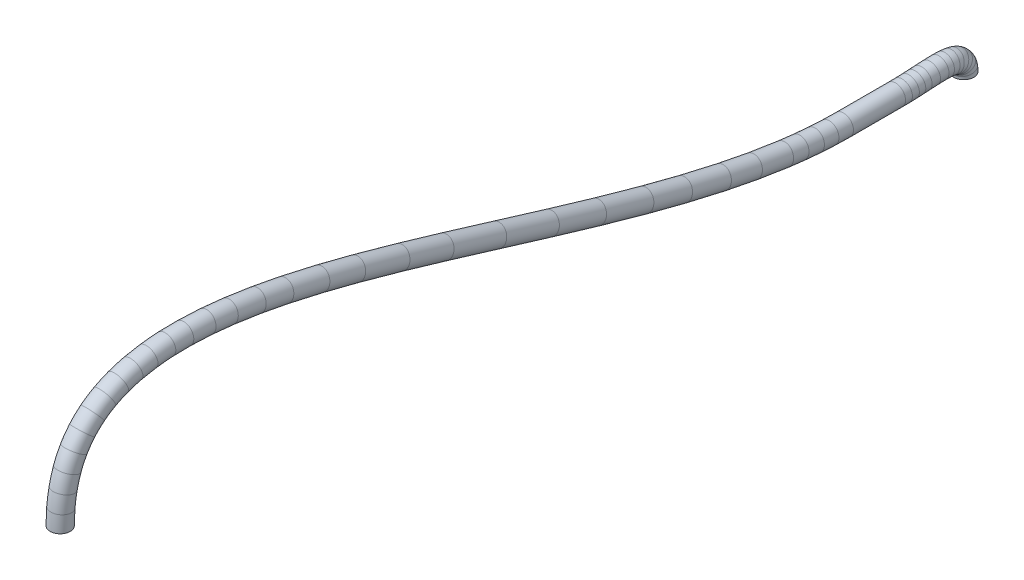
ISO-10303-21;
HEADER;
FILE_DESCRIPTION(('STEP AP214'),'2;1');
FILE_NAME('part.step','',(''),(''),'','','');
FILE_SCHEMA(('AUTOMOTIVE_DESIGN { 1 0 10303 214 1 1 1 1 }'));
ENDSEC;
DATA;
#1=APPLICATION_CONTEXT('core data for automotive mechanical design processes');
#2=APPLICATION_PROTOCOL_DEFINITION('international standard','automotive_design',2000,#1);
#3=PRODUCT_CONTEXT('',#1,'mechanical');
#4=PRODUCT('Part','Part','',(#3));
#5=PRODUCT_RELATED_PRODUCT_CATEGORY('part','',(#4));
#6=PRODUCT_DEFINITION_FORMATION('','',#4);
#7=PRODUCT_DEFINITION_CONTEXT('part definition',#1,'design');
#8=PRODUCT_DEFINITION('design','',#6,#7);
#9=PRODUCT_DEFINITION_SHAPE('','',#8);
#10=(LENGTH_UNIT() NAMED_UNIT(*) SI_UNIT(.MILLI.,.METRE.));
#11=(NAMED_UNIT(*) PLANE_ANGLE_UNIT() SI_UNIT($,.RADIAN.));
#12=(NAMED_UNIT(*) SI_UNIT($,.STERADIAN.) SOLID_ANGLE_UNIT());
#13=UNCERTAINTY_MEASURE_WITH_UNIT(LENGTH_MEASURE(1.E-05),#10,'distance_accuracy_value','');
#14=(GEOMETRIC_REPRESENTATION_CONTEXT(3) GLOBAL_UNCERTAINTY_ASSIGNED_CONTEXT((#13)) GLOBAL_UNIT_ASSIGNED_CONTEXT((#10,
#11,#12)) REPRESENTATION_CONTEXT('',''));
#15=CARTESIAN_POINT('',(0.,0.,0.));
#16=DIRECTION('',(0.,0.,1.));
#17=DIRECTION('',(1.,0.,0.));
#18=AXIS2_PLACEMENT_3D('',#15,#16,#17);
#19=CARTESIAN_POINT('',(-5.24968353162595,128.049999999714,224.960489149716));
#20=DIRECTION('',(0.,1.,0.));
#21=DIRECTION('',(0.,0.,-1.));
#22=AXIS2_PLACEMENT_3D('',#19,#20,#21);
#23=PLANE('',#22);
#24=CARTESIAN_POINT('',(-5.24968353162595,128.049999999714,224.960489149716));
#25=DIRECTION('',(0.,-1.,0.));
#26=DIRECTION('',(0.,0.,-1.));
#27=AXIS2_PLACEMENT_3D('',#24,#25,#26);
#28=CIRCLE('',#27,0.77);
#29=CARTESIAN_POINT('',(-5.24968353162595,128.049999999714,224.190489149716));
#30=VERTEX_POINT('',#29);
#31=EDGE_CURVE('E11',#30,#30,#28,.T.);
#32=ORIENTED_EDGE('',*,*,#31,.T.);
#33=EDGE_LOOP('',(#32));
#34=FACE_BOUND('',#33,.T.);
#35=ADVANCED_FACE('F42',(#34),#23,.F.);
#36=CARTESIAN_POINT('',(-5.07489488065343,128.049999999715,211.014651433645));
#37=DIRECTION('',(-0.999921466294673,0.,-0.012532407714073));
#38=DIRECTION('',(-0.012532407714073,0.,0.999921466294673));
#39=AXIS2_PLACEMENT_3D('',#36,#37,#38);
#40=TOROIDAL_SURFACE('',#39,13.9469330203995,0.77);
#41=ORIENTED_EDGE('',*,*,#31,.F.);
#42=EDGE_LOOP('',(#41));
#43=FACE_BOUND('',#42,.T.);
#44=CARTESIAN_POINT('',(-5.24904137688922,129.244421709112,224.909253639303));
#45=DIRECTION('',(-0.00107328111655938,-0.996326107369345,0.0856337307484272));
#46=DIRECTION('',(-4.60391044394124E-05,-0.0856337307484272,-0.996326684395488));
#47=AXIS2_PLACEMENT_3D('',#44,#45,#46);
#48=CIRCLE('',#47,0.77);
#49=CARTESIAN_POINT('',(-5.24907682699964,129.178483736436,224.142082092318));
#50=VERTEX_POINT('',#49);
#51=EDGE_CURVE('E52',#50,#50,#48,.T.);
#52=ORIENTED_EDGE('',*,*,#51,.T.);
#53=EDGE_LOOP('',(#52));
#54=FACE_BOUND('',#53,.T.);
#55=ADVANCED_FACE('F430',(#43,#54),#40,.T.);
#56=CARTESIAN_POINT('',(-5.12396192345315,128.373826335564,214.781671357992));
#57=DIRECTION('',(0.999923726127993,-1.56135381442176E-05,0.0123507765961815));
#58=DIRECTION('',(0.0123507765976869,0.,-0.999923726249874));
#59=AXIS2_PLACEMENT_3D('',#56,#57,#58);
#60=TOROIDAL_SURFACE('',#59,10.1657023386899,0.77);
#61=CARTESIAN_POINT('',(-5.24689794232879,130.426519028251,224.7372147125));
#62=DIRECTION('',(-0.00250920096557245,-0.979401327154709,0.201907761807487));
#63=DIRECTION('',(-0.000256872652281758,-0.201907759491489,-0.979404508195448));
#64=AXIS2_PLACEMENT_3D('',#61,#62,#63);
#65=CIRCLE('',#64,0.77);
#66=CARTESIAN_POINT('',(-5.24709573427105,130.271050053443,223.983073241189));
#67=VERTEX_POINT('',#66);
#68=EDGE_CURVE('E271',#67,#67,#65,.T.);
#69=ORIENTED_EDGE('',*,*,#68,.T.);
#70=EDGE_LOOP('',(#69));
#71=FACE_BOUND('',#70,.T.);
#72=ORIENTED_EDGE('',*,*,#51,.F.);
#73=EDGE_LOOP('',(#72));
#74=FACE_BOUND('',#73,.T.);
#75=ADVANCED_FACE('F435',(#71,#74),#60,.T.);
#76=CARTESIAN_POINT('',(-5.14297806845378,128.677711002938,216.255499449286));
#77=DIRECTION('',(0.999924861807434,-3.46504543539627E-05,0.0122584476476254));
#78=DIRECTION('',(0.0122584476549845,0.,-0.999924862407716));
#79=AXIS2_PLACEMENT_3D('',#76,#77,#78);
#80=TOROIDAL_SURFACE('',#79,8.66075185280264,0.77);
#81=CARTESIAN_POINT('',(-5.24293003548532,131.574581719271,224.416796669273));
#82=DIRECTION('',(-0.0041328895323715,-0.942401928786135,0.334457058296406));
#83=DIRECTION('',(-0.000714986324046932,-0.334457044428597,-0.942410724804553));
#84=AXIS2_PLACEMENT_3D('',#81,#82,#83);
#85=CIRCLE('',#84,0.77);
#86=CARTESIAN_POINT('',(-5.24348057495484,131.317049795061,223.691140411173));
#87=VERTEX_POINT('',#86);
#88=EDGE_CURVE('E267',#87,#87,#85,.T.);
#89=ORIENTED_EDGE('',*,*,#88,.T.);
#90=EDGE_LOOP('',(#89));
#91=FACE_BOUND('',#90,.T.);
#92=ORIENTED_EDGE('',*,*,#68,.F.);
#93=EDGE_LOOP('',(#92));
#94=FACE_BOUND('',#93,.T.);
#95=ADVANCED_FACE('F543',(#91,#94),#80,.T.);
#96=CARTESIAN_POINT('',(-5.16728173386017,129.341525842741,218.125634719291));
#97=DIRECTION('',(0.999927259751701,-0.000104786281682033,0.0120608550811853));
#98=DIRECTION('',(0.0120608551474004,0.,-0.999927265241384));
#99=AXIS2_PLACEMENT_3D('',#96,#97,#98);
#100=TOROIDAL_SURFACE('',#99,6.67615008025853,0.77);
#101=CARTESIAN_POINT('',(-5.23682959366278,132.656122237585,223.920424942294));
#102=DIRECTION('',(-0.00607896479311672,-0.868046320935459,0.496445999981325));
#103=DIRECTION('',(-0.00162868645288771,-0.496445919935974,-0.868066124186034));
#104=AXIS2_PLACEMENT_3D('',#101,#102,#103);
#105=CIRCLE('',#104,0.77);
#106=CARTESIAN_POINT('',(-5.2380836822315,132.273858879235,223.252014026671));
#107=VERTEX_POINT('',#106);
#108=EDGE_CURVE('E264',#107,#107,#105,.T.);
#109=ORIENTED_EDGE('',*,*,#108,.T.);
#110=EDGE_LOOP('',(#109));
#111=FACE_BOUND('',#110,.T.);
#112=ORIENTED_EDGE('',*,*,#88,.F.);
#113=EDGE_LOOP('',(#112));
#114=FACE_BOUND('',#113,.T.);
#115=ADVANCED_FACE('F572',(#111,#114),#100,.T.);
#116=CARTESIAN_POINT('',(-5.17379080379215,129.618432694617,218.609732497533));
#117=DIRECTION('',(0.999928443325836,-0.000161505477794451,0.0119616948611252));
#118=DIRECTION('',(0.0119616950171297,0.,-0.999928456366913));
#119=AXIS2_PLACEMENT_3D('',#116,#117,#118);
#120=TOROIDAL_SURFACE('',#119,6.11841367442019,0.77);
#121=CARTESIAN_POINT('',(-5.22911386483874,133.561643425338,223.287660926163));
#122=DIRECTION('',(-0.00783258490682083,-0.764619016978677,0.644434953651833));
#123=DIRECTION('',(-0.00288966355690776,-0.644434724493458,-0.764653866603426));
#124=AXIS2_PLACEMENT_3D('',#121,#122,#123);
#125=CIRCLE('',#124,0.77);
#126=CARTESIAN_POINT('',(-5.23133890577756,133.065428687478,222.698877448878));
#127=VERTEX_POINT('',#126);
#128=EDGE_CURVE('E268',#127,#127,#125,.T.);
#129=ORIENTED_EDGE('',*,*,#128,.T.);
#130=EDGE_LOOP('',(#129));
#131=FACE_BOUND('',#130,.T.);
#132=ORIENTED_EDGE('',*,*,#108,.F.);
#133=EDGE_LOOP('',(#132));
#134=FACE_BOUND('',#133,.T.);
#135=ADVANCED_FACE('F525',(#131,#134),#120,.T.);
#136=CARTESIAN_POINT('',(-5.17630312424206,129.698910660878,218.705188687702));
#137=DIRECTION('',(0.999930503616955,-0.00031025322509349,0.0117852314053984));
#138=DIRECTION('',(0.0117852319726044,0.,-0.999930551742146));
#139=AXIS2_PLACEMENT_3D('',#136,#137,#138);
#140=TOROIDAL_SURFACE('',#139,5.99354195782581,0.77);
#141=CARTESIAN_POINT('',(-5.21960252022103,134.337006732867,222.501072667689));
#142=DIRECTION('',(-0.00931648116066426,-0.633370134036581,0.773792915765754));
#143=DIRECTION('',(-0.00447648709641838,-0.773792328230094,-0.63342355011124));
#144=AXIS2_PLACEMENT_3D('',#141,#142,#143);
#145=CIRCLE('',#144,0.77);
#146=CARTESIAN_POINT('',(-5.22304941528527,133.74118664013,222.013336534104));
#147=VERTEX_POINT('',#146);
#148=EDGE_CURVE('E293',#147,#147,#145,.T.);
#149=ORIENTED_EDGE('',*,*,#148,.T.);
#150=EDGE_LOOP('',(#149));
#151=FACE_BOUND('',#150,.T.);
#152=ORIENTED_EDGE('',*,*,#128,.F.);
#153=EDGE_LOOP('',(#152));
#154=FACE_BOUND('',#153,.T.);
#155=ADVANCED_FACE('F521',(#151,#154),#140,.T.);
#156=CARTESIAN_POINT('',(-5.1742727820534,129.387492829691,218.450309334562));
#157=DIRECTION('',(0.999931484793308,-0.000416360646929899,0.0116983914647494));
#158=DIRECTION('',(0.0116983924787438,0.,-0.999931571465474));
#159=AXIS2_PLACEMENT_3D('',#156,#157,#158);
#160=TOROIDAL_SURFACE('',#159,6.3959695311887,0.77);
#161=CARTESIAN_POINT('',(-5.20845243151791,134.970619210377,221.570558974054));
#162=DIRECTION('',(-0.0104148005759073,-0.487875323146402,0.87285119063547));
#163=DIRECTION('',(-0.00621966975069926,-0.872850040660919,-0.487948893047647));
#164=AXIS2_PLACEMENT_3D('',#161,#162,#163);
#165=CIRCLE('',#164,0.77);
#166=CARTESIAN_POINT('',(-5.21324157722595,134.298524679068,221.194838326407));
#167=VERTEX_POINT('',#166);
#168=EDGE_CURVE('E289',#167,#167,#165,.T.);
#169=ORIENTED_EDGE('',*,*,#168,.T.);
#170=EDGE_LOOP('',(#169));
#171=FACE_BOUND('',#170,.T.);
#172=ORIENTED_EDGE('',*,*,#148,.F.);
#173=EDGE_LOOP('',(#172));
#174=FACE_BOUND('',#173,.T.);
#175=ADVANCED_FACE('F524',(#171,#174),#160,.T.);
#176=CARTESIAN_POINT('',(-5.16806613831763,127.989365269457,217.668907760488));
#177=DIRECTION('',(0.999933013635121,-0.000673159565444983,0.0115548733781435));
#178=DIRECTION('',(0.011554875996154,0.,-0.999933240191921));
#179=AXIS2_PLACEMENT_3D('',#176,#177,#178);
#180=TOROIDAL_SURFACE('',#179,7.99765089464502,0.77);
#181=CARTESIAN_POINT('',(-5.19633890299016,135.449911800551,220.550203639215));
#182=DIRECTION('',(-0.0110213915987776,-0.360284488203109,0.932777367053602));
#183=DIRECTION('',(-0.0077342093815182,-0.932775406000503,-0.360375115630698));
#184=AXIS2_PLACEMENT_3D('',#181,#182,#183);
#185=CIRCLE('',#184,0.77);
#186=CARTESIAN_POINT('',(-5.20229424421393,134.731674737931,220.272714800179));
#187=VERTEX_POINT('',#186);
#188=EDGE_CURVE('E282',#187,#187,#185,.T.);
#189=ORIENTED_EDGE('',*,*,#188,.T.);
#190=EDGE_LOOP('',(#189));
#191=FACE_BOUND('',#190,.T.);
#192=ORIENTED_EDGE('',*,*,#168,.F.);
#193=EDGE_LOOP('',(#192));
#194=FACE_BOUND('',#193,.T.);
#195=ADVANCED_FACE('F506',(#191,#194),#180,.T.);
#196=CARTESIAN_POINT('',(-5.16499366198673,126.759352754111,217.193852744941));
#197=DIRECTION('',(0.99993360202921,-0.000832261267531237,0.0114934274292904));
#198=DIRECTION('',(0.0114934314098044,0.,-0.999933948335803));
#199=AXIS2_PLACEMENT_3D('',#196,#197,#198);
#200=TOROIDAL_SURFACE('',#199,9.31621652760916,0.77);
#201=CARTESIAN_POINT('',(-5.18322899083849,135.801932792062,219.435125624205));
#202=DIRECTION('',(-0.0113560651723369,-0.240584108696933,0.970561861205304));
#203=DIRECTION('',(-0.00914133689401875,-0.970558910298777,-0.240690335492395));
#204=AXIS2_PLACEMENT_3D('',#201,#202,#203);
#205=CIRCLE('',#204,0.77);
#206=CARTESIAN_POINT('',(-5.19026782024688,135.054602431132,219.249794065876));
#207=VERTEX_POINT('',#206);
#208=EDGE_CURVE('E279',#207,#207,#205,.T.);
#209=ORIENTED_EDGE('',*,*,#208,.T.);
#210=EDGE_LOOP('',(#209));
#211=FACE_BOUND('',#210,.T.);
#212=ORIENTED_EDGE('',*,*,#188,.F.);
#213=EDGE_LOOP('',(#212));
#214=FACE_BOUND('',#213,.T.);
#215=ADVANCED_FACE('F500',(#211,#214),#200,.T.);
#216=CARTESIAN_POINT('',(-5.16317642337029,123.386435817015,216.357791066875));
#217=DIRECTION('',(0.999934288916584,-0.00121053123399229,0.011399669425782));
#218=DIRECTION('',(0.0113996777782484,0.,-0.999935021562177));
#219=AXIS2_PLACEMENT_3D('',#216,#217,#218);
#220=TOROIDAL_SURFACE('',#219,12.7912061675432,0.77);
#221=CARTESIAN_POINT('',(-5.16986690857347,136.031256444593,218.287408063689));
#222=DIRECTION('',(-0.0114518236066479,-0.150851017772034,0.988490175051439));
#223=DIRECTION('',(-0.0101859073416778,-0.988486109490566,-0.150968402773002));
#224=AXIS2_PLACEMENT_3D('',#221,#222,#223);
#225=CIRCLE('',#224,0.77);
#226=CARTESIAN_POINT('',(-5.17771005722656,135.270122140285,218.171162393554));
#227=VERTEX_POINT('',#226);
#228=EDGE_CURVE('E283',#227,#227,#225,.T.);
#229=ORIENTED_EDGE('',*,*,#228,.T.);
#230=EDGE_LOOP('',(#229));
#231=FACE_BOUND('',#230,.T.);
#232=ORIENTED_EDGE('',*,*,#208,.F.);
#233=EDGE_LOOP('',(#232));
#234=FACE_BOUND('',#233,.T.);
#235=ADVANCED_FACE('F493',(#231,#234),#220,.T.);
#236=CARTESIAN_POINT('',(-5.16548148912358,121.04671640111,216.000705623541));
#237=DIRECTION('',(0.99993438386414,-0.00144161136022933,0.0113644059646101));
#238=DIRECTION('',(0.0113644177736289,0.,-0.999935422919233));
#239=AXIS2_PLACEMENT_3D('',#236,#237,#238);
#240=TOROIDAL_SURFACE('',#239,15.158016611563,0.77);
#241=CARTESIAN_POINT('',(-5.15422136859531,136.176266224485,216.929179073955));
#242=DIRECTION('',(-0.0114313665546598,-0.0612405030805033,0.998057575814712));
#243=DIRECTION('',(-0.0112180134444051,-0.998052125044577,-0.0613686554225046));
#244=AXIS2_PLACEMENT_3D('',#241,#242,#243);
#245=CIRCLE('',#244,0.77);
#246=CARTESIAN_POINT('',(-5.1628592389475,135.4077660882,216.88192520928));
#247=VERTEX_POINT('',#246);
#248=EDGE_CURVE('E242',#247,#247,#245,.T.);
#249=ORIENTED_EDGE('',*,*,#248,.T.);
#250=EDGE_LOOP('',(#249));
#251=FACE_BOUND('',#250,.T.);
#252=ORIENTED_EDGE('',*,*,#228,.F.);
#253=EDGE_LOOP('',(#252));
#254=FACE_BOUND('',#253,.T.);
#255=ADVANCED_FACE('F490',(#251,#254),#240,.T.);
#256=CARTESIAN_POINT('',(-5.18281952873512,114.77656851712,215.61577271225));
#257=DIRECTION('',(0.999933770131024,-0.00203156120988107,0.0113281997954771));
#258=DIRECTION('',(0.0113282231726545,0.,-0.999935833621213));
#259=AXIS2_PLACEMENT_3D('',#256,#257,#258);
#260=TOROIDAL_SURFACE('',#259,21.439984050655,0.77);
#261=CARTESIAN_POINT('',(-5.13866380234682,136.216442461496,215.56312659716));
#262=DIRECTION('',(-0.0113231530981037,0.00247867876726914,0.999932818921094));
#263=DIRECTION('',(-0.0119436112864676,-0.999925926538434,0.00234341325684274));
#264=AXIS2_PLACEMENT_3D('',#261,#262,#263);
#265=CIRCLE('',#264,0.77);
#266=CARTESIAN_POINT('',(-5.1478603830374,135.446499498061,215.564931025368));
#267=VERTEX_POINT('',#266);
#268=EDGE_CURVE('E235',#267,#267,#265,.T.);
#269=ORIENTED_EDGE('',*,*,#268,.T.);
#270=EDGE_LOOP('',(#269));
#271=FACE_BOUND('',#270,.T.);
#272=ORIENTED_EDGE('',*,*,#248,.F.);
#273=EDGE_LOOP('',(#272));
#274=FACE_BOUND('',#273,.T.);
#275=ADVANCED_FACE('F492',(#271,#274),#260,.T.);
#276=CARTESIAN_POINT('',(-5.20077807656551,110.657380501893,215.625780181042));
#277=DIRECTION('',(0.999932937891432,-0.00240229079996762,0.0113291093525696));
#278=DIRECTION('',(0.0113291420428623,0.,-0.999935823210956));
#279=AXIS2_PLACEMENT_3D('',#276,#277,#278);
#280=TOROIDAL_SURFACE('',#279,25.5592142271517,0.77);
#281=CARTESIAN_POINT('',(-5.11965239461576,136.156251354112,213.872373270188));
#282=DIRECTION('',(-0.0111375608198021,0.0686331117157715,0.997579796665508));
#283=DIRECTION('',(-0.0126873957821722,-0.997571066073339,0.0684908615916703));
#284=AXIS2_PLACEMENT_3D('',#281,#282,#283);
#285=CIRCLE('',#284,0.77);
#286=CARTESIAN_POINT('',(-5.12942168936803,135.388121633236,213.925111233614));
#287=VERTEX_POINT('',#286);
#288=EDGE_CURVE('E230',#287,#287,#285,.T.);
#289=ORIENTED_EDGE('',*,*,#288,.T.);
#290=EDGE_LOOP('',(#289));
#291=FACE_BOUND('',#290,.T.);
#292=ORIENTED_EDGE('',*,*,#268,.F.);
#293=EDGE_LOOP('',(#292));
#294=FACE_BOUND('',#293,.T.);
#295=ADVANCED_FACE('F231',(#291,#294),#280,.T.);
#296=CARTESIAN_POINT('',(-5.27324801372933,99.4965880502139,216.392829372891));
#297=DIRECTION('',(0.999929239218927,-0.0034058226866631,0.0113981106716926));
#298=DIRECTION('',(0.0113981767791906,0.,-0.999935038673068));
#299=AXIS2_PLACEMENT_3D('',#296,#297,#298);
#300=TOROIDAL_SURFACE('',#299,36.7465264227114,0.77);
#301=CARTESIAN_POINT('',(-5.10097097834688,136.001245847422,212.187180330605));
#302=DIRECTION('',(-0.0109332901309577,0.114495586102504,0.993363591002789));
#303=DIRECTION('',(-0.013195763290434,-0.993352983136307,0.114349126474064));
#304=AXIS2_PLACEMENT_3D('',#301,#302,#303);
#305=CIRCLE('',#304,0.77);
#306=CARTESIAN_POINT('',(-5.11113171608051,135.236364050407,212.275229157991));
#307=VERTEX_POINT('',#306);
#308=EDGE_CURVE('E236',#307,#307,#305,.T.);
#309=ORIENTED_EDGE('',*,*,#308,.T.);
#310=EDGE_LOOP('',(#309));
#311=FACE_BOUND('',#310,.T.);
#312=ORIENTED_EDGE('',*,*,#288,.F.);
#313=EDGE_LOOP('',(#312));
#314=FACE_BOUND('',#313,.T.);
#315=ADVANCED_FACE('F44',(#311,#314),#300,.T.);
#316=CARTESIAN_POINT('',(-5.33695933223886,92.2051185638422,217.232546577784));
#317=DIRECTION('',(0.999925902291017,-0.00406610011188762,0.0114741778518016));
#318=DIRECTION('',(0.011474272705245,0.,-0.999934168366041));
#319=AXIS2_PLACEMENT_3D('',#316,#317,#318);
#320=TOROIDAL_SURFACE('',#319,44.0864171385114,0.77);
#321=CARTESIAN_POINT('',(-5.0779174970338,135.705597552396,210.073398499639));
#322=DIRECTION('',(-0.0106613884787904,0.162444361746452,0.986660105675958));
#323=DIRECTION('',(-0.0137186629416303,-0.986647080967109,0.162293979882735));
#324=AXIS2_PLACEMENT_3D('',#321,#322,#323);
#325=CIRCLE('',#324,0.77);
#326=CARTESIAN_POINT('',(-5.08848086749886,134.945879300052,210.198364864149));
#327=VERTEX_POINT('',#326);
#328=EDGE_CURVE('E245',#327,#327,#325,.T.);
#329=ORIENTED_EDGE('',*,*,#328,.T.);
#330=EDGE_LOOP('',(#329));
#331=FACE_BOUND('',#330,.T.);
#332=ORIENTED_EDGE('',*,*,#308,.F.);
#333=EDGE_LOOP('',(#332));
#334=FACE_BOUND('',#333,.T.);
#335=ADVANCED_FACE('F603',(#331,#334),#320,.T.);
#336=CARTESIAN_POINT('',(-5.58426599900184,71.8011531395204,220.589196440206));
#337=DIRECTION('',(0.999912601927665,-0.0059827950896209,0.0117896000424723));
#338=DIRECTION('',(0.0117898110456484,0.,-0.999930497762474));
#339=AXIS2_PLACEMENT_3D('',#336,#337,#338);
#340=TOROIDAL_SURFACE('',#339,64.7658583734564,0.77);
#341=CARTESIAN_POINT('',(-5.05543554196876,135.324139513465,207.973057913148));
#342=DIRECTION('',(-0.010397929528536,0.194875369792719,0.980772895888579));
#343=DIRECTION('',(-0.0140657835414617,-0.980757382188605,0.194723165072674));
#344=AXIS2_PLACEMENT_3D('',#341,#342,#343);
#345=CIRCLE('',#344,0.77);
#346=CARTESIAN_POINT('',(-5.06626619529569,134.56895632918,208.122994750253));
#347=VERTEX_POINT('',#346);
#348=EDGE_CURVE('E299',#347,#347,#345,.T.);
#349=ORIENTED_EDGE('',*,*,#348,.T.);
#350=EDGE_LOOP('',(#349));
#351=FACE_BOUND('',#350,.T.);
#352=ORIENTED_EDGE('',*,*,#328,.F.);
#353=EDGE_LOOP('',(#352));
#354=FACE_BOUND('',#353,.T.);
#355=ADVANCED_FACE('F605',(#351,#354),#340,.T.);
#356=CARTESIAN_POINT('',(-5.81591775887796,57.5750148695578,223.413413207446));
#357=DIRECTION('',(0.999899919531076,-0.00738368115377129,0.0120678156418905));
#358=DIRECTION('',(0.0120681446164382,0.,-0.999927177291185));
#359=AXIS2_PLACEMENT_3D('',#356,#357,#358);
#360=TOROIDAL_SURFACE('',#359,79.2711125676327,0.77);
#361=CARTESIAN_POINT('',(-5.02680457670898,134.730170501626,205.23736997776));
#362=DIRECTION('',(-0.0100526920883572,0.229386802407344,0.973283431618514));
#363=DIRECTION('',(-0.0144269577185918,-0.973264576160402,0.229233347666301));
#364=AXIS2_PLACEMENT_3D('',#361,#362,#363);
#365=CIRCLE('',#364,0.77);
#366=CARTESIAN_POINT('',(-5.03791333415229,133.980756777982,205.413879655463));
#367=VERTEX_POINT('',#366);
#368=EDGE_CURVE('E357',#367,#367,#365,.T.);
#369=ORIENTED_EDGE('',*,*,#368,.T.);
#370=EDGE_LOOP('',(#369));
#371=FACE_BOUND('',#370,.T.);
#372=ORIENTED_EDGE('',*,*,#348,.F.);
#373=EDGE_LOOP('',(#372));
#374=FACE_BOUND('',#373,.T.);
#375=ADVANCED_FACE('F512',(#371,#374),#360,.T.);
#376=CARTESIAN_POINT('',(-6.8916457097763,12.5276460749525,234.019221944709));
#377=DIRECTION('',(0.999839165076537,-0.0121510282503366,0.0131907729687246));
#378=DIRECTION('',(0.0131917468688151,0.,-0.99991298512148));
#379=AXIS2_PLACEMENT_3D('',#376,#377,#378);
#380=TOROIDAL_SURFACE('',#379,125.560063759742,0.77);
#381=CARTESIAN_POINT('',(-4.99912407683101,134.057583464795,202.519661769361));
#382=DIRECTION('',(-0.00971902793698233,0.251030915605625,0.967930276366104));
#383=DIRECTION('',(-0.0146474139412616,-0.967907881078682,0.250878032140339));
#384=AXIS2_PLACEMENT_3D('',#381,#382,#383);
#385=CIRCLE('',#384,0.77);
#386=CARTESIAN_POINT('',(-5.01040258556578,133.312294396364,202.712837854109));
#387=VERTEX_POINT('',#386);
#388=EDGE_CURVE('E353',#387,#387,#385,.T.);
#389=ORIENTED_EDGE('',*,*,#388,.T.);
#390=EDGE_LOOP('',(#389));
#391=FACE_BOUND('',#390,.T.);
#392=ORIENTED_EDGE('',*,*,#368,.F.);
#393=EDGE_LOOP('',(#392));
#394=FACE_BOUND('',#393,.T.);
#395=ADVANCED_FACE('F551',(#391,#394),#380,.T.);
#396=CARTESIAN_POINT('',(-8.13767229498737,-23.3288101017453,243.306015711337));
#397=DIRECTION('',(0.999766490161775,-0.0162437742654656,0.0142514892982588));
#398=DIRECTION('',(-0.0162454241122463,-0.999868034390246,0.));
#399=AXIS2_PLACEMENT_3D('',#396,#397,#398);
#400=TOROIDAL_SURFACE('',#399,162.615663552684,0.77);
#401=CARTESIAN_POINT('',(-4.96593820794016,133.145546053802,199.152080425026));
#402=DIRECTION('',(-0.00930270812435612,0.271737825723932,0.962326355085624));
#403=DIRECTION('',(-0.0148514872069349,-0.962299395928268,0.271586645334106));
#404=AXIS2_PLACEMENT_3D('',#401,#402,#403);
#405=CIRCLE('',#404,0.77);
#406=CARTESIAN_POINT('',(-4.9773738530895,132.404575518937,199.361202141933));
#407=VERTEX_POINT('',#406);
#408=EDGE_CURVE('E350',#407,#407,#405,.T.);
#409=ORIENTED_EDGE('',*,*,#408,.T.);
#410=EDGE_LOOP('',(#409));
#411=FACE_BOUND('',#410,.T.);
#412=ORIENTED_EDGE('',*,*,#388,.F.);
#413=EDGE_LOOP('',(#412));
#414=FACE_BOUND('',#413,.T.);
#415=ADVANCED_FACE('F486',(#411,#414),#400,.T.);
#416=CARTESIAN_POINT('',(-18.4990722425779,-186.818386888552,289.371378891754));
#417=DIRECTION('',(0.999129131083777,-0.0366199012053684,0.0199990563648998));
#418=DIRECTION('',(-0.0366272266920211,-0.999328998010591,0.));
#419=AXIS2_PLACEMENT_3D('',#416,#417,#418);
#420=TOROIDAL_SURFACE('',#419,332.71547291427,0.77);
#421=CARTESIAN_POINT('',(-4.93422373253834,132.179814249409,195.799329260406));
#422=DIRECTION('',(-0.00887564310102088,0.281807888255407,0.959429797888606));
#423=DIRECTION('',(-0.014946775507647,-0.959397788967465,0.281660214489489));
#424=AXIS2_PLACEMENT_3D('',#421,#422,#423);
#425=CIRCLE('',#424,0.77);
#426=CARTESIAN_POINT('',(-4.94573274967923,131.441077951904,196.016207625562));
#427=VERTEX_POINT('',#426);
#428=EDGE_CURVE('E354',#427,#427,#425,.T.);
#429=ORIENTED_EDGE('',*,*,#428,.T.);
#430=EDGE_LOOP('',(#429));
#431=FACE_BOUND('',#430,.T.);
#432=ORIENTED_EDGE('',*,*,#408,.F.);
#433=EDGE_LOOP('',(#432));
#434=FACE_BOUND('',#433,.T.);
#435=ADVANCED_FACE('F439',(#431,#434),#420,.T.);
#436=CARTESIAN_POINT('',(-50.8662060077854,-443.679255745311,364.518242226291));
#437=DIRECTION('',(0.997043751117185,-0.0707369243477187,0.0300007648568693));
#438=DIRECTION('',(-0.0707687790914665,-0.997492746793631,0.));
#439=AXIS2_PLACEMENT_3D('',#436,#437,#438);
#440=TOROIDAL_SURFACE('',#439,601.821806752887,0.77);
#441=CARTESIAN_POINT('',(-4.89817440198848,130.985994759764,191.786435614028));
#442=DIRECTION('',(-0.00834446385745979,0.288457883314737,0.957456223268987));
#443=DIRECTION('',(-0.0150065627843381,-0.957417857161314,0.288315538710694));
#444=AXIS2_PLACEMENT_3D('',#441,#442,#443);
#445=CIRCLE('',#444,0.77);
#446=CARTESIAN_POINT('',(-4.90972945533242,130.248783009749,192.008438578835));
#447=VERTEX_POINT('',#446);
#448=EDGE_CURVE('E249',#447,#447,#445,.T.);
#449=ORIENTED_EDGE('',*,*,#448,.T.);
#450=EDGE_LOOP('',(#449));
#451=FACE_BOUND('',#450,.T.);
#452=ORIENTED_EDGE('',*,*,#428,.F.);
#453=EDGE_LOOP('',(#452));
#454=FACE_BOUND('',#453,.T.);
#455=ADVANCED_FACE('F471',(#451,#454),#440,.T.);
#456=CARTESIAN_POINT('',(-128.322876109013,1006.20272825999,-72.9703994149224));
#457=DIRECTION('',(-0.990977551170572,-0.130471344857442,0.0306711794208627));
#458=DIRECTION('',(-0.130532756772581,0.991443997111965,0.));
#459=AXIS2_PLACEMENT_3D('',#456,#457,#458);
#460=TOROIDAL_SURFACE('',#459,922.677716911398,0.77);
#461=CARTESIAN_POINT('',(-4.86450797302752,129.787270950207,187.774968349309));
#462=DIRECTION('',(-0.00773737452209198,0.284150592323877,0.95874844141594));
#463=DIRECTION('',(-0.0149704803120792,-0.958702606388972,0.284016191831061));
#464=AXIS2_PLACEMENT_3D('',#461,#462,#463);
#465=CIRCLE('',#464,0.77);
#466=CARTESIAN_POINT('',(-4.87603524286782,129.049069943287,187.993660817018));
#467=VERTEX_POINT('',#466);
#468=EDGE_CURVE('E262',#467,#467,#465,.T.);
#469=ORIENTED_EDGE('',*,*,#468,.T.);
#470=EDGE_LOOP('',(#469));
#471=FACE_BOUND('',#470,.T.);
#472=ORIENTED_EDGE('',*,*,#448,.F.);
#473=EDGE_LOOP('',(#472));
#474=FACE_BOUND('',#473,.T.);
#475=ADVANCED_FACE('F463',(#471,#474),#460,.T.);
#476=CARTESIAN_POINT('',(-33.6032976752997,537.442123336543,66.7236836376807));
#477=DIRECTION('',(-0.997694178442122,-0.0668434624221849,0.0117591595835847));
#478=DIRECTION('',(-0.0668480843861309,0.997763165091749,0.));
#479=AXIS2_PLACEMENT_3D('',#476,#477,#478);
#480=TOROIDAL_SURFACE('',#479,426.218031338437,0.77);
#481=CARTESIAN_POINT('',(-4.83661388280709,128.737820788068,184.176147298344));
#482=DIRECTION('',(-0.00714402019866776,0.275727216171857,0.961209376378279));
#483=DIRECTION('',(-0.0149052570580215,-0.961156479378031,0.275601261720011));
#484=AXIS2_PLACEMENT_3D('',#481,#482,#483);
#485=CIRCLE('',#484,0.77);
#486=CARTESIAN_POINT('',(-4.84809093074177,127.997730298947,184.388360269869));
#487=VERTEX_POINT('',#486);
#488=EDGE_CURVE('E259',#487,#487,#485,.T.);
#489=ORIENTED_EDGE('',*,*,#488,.T.);
#490=EDGE_LOOP('',(#489));
#491=FACE_BOUND('',#490,.T.);
#492=ORIENTED_EDGE('',*,*,#468,.F.);
#493=EDGE_LOOP('',(#492));
#494=FACE_BOUND('',#493,.T.);
#495=ADVANCED_FACE('F452',(#491,#494),#480,.T.);
#496=CARTESIAN_POINT('',(-12.1184575935649,313.474990909698,131.129341334306));
#497=DIRECTION('',(-0.999257547958647,-0.0383608735236405,0.00357718187608632));
#498=DIRECTION('',(-0.0383611189632797,0.9992639413848,0.));
#499=AXIS2_PLACEMENT_3D('',#496,#497,#498);
#500=TOROIDAL_SURFACE('',#499,192.340351708533,0.77);
#501=CARTESIAN_POINT('',(-4.81121754884281,127.739344234701,180.562980614779));
#502=DIRECTION('',(-0.0064048307299186,0.256956359192495,0.966401783738968));
#503=DIRECTION('',(-0.0147734023820948,-0.96634044815675,0.256842139919191));
#504=AXIS2_PLACEMENT_3D('',#501,#502,#503);
#505=CIRCLE('',#504,0.77);
#506=CARTESIAN_POINT('',(-4.82259306867702,126.99526208962,180.760749062517));
#507=VERTEX_POINT('',#506);
#508=EDGE_CURVE('E263',#507,#507,#505,.T.);
#509=ORIENTED_EDGE('',*,*,#508,.T.);
#510=EDGE_LOOP('',(#509));
#511=FACE_BOUND('',#510,.T.);
#512=ORIENTED_EDGE('',*,*,#488,.F.);
#513=EDGE_LOOP('',(#512));
#514=FACE_BOUND('',#513,.T.);
#515=ADVANCED_FACE('F443',(#511,#514),#500,.T.);
#516=CARTESIAN_POINT('',(-9.66448189777148,270.427390931367,142.591522021112));
#517=DIRECTION('',(-0.999439724113134,-0.0333938837880907,0.00225530268720076));
#518=DIRECTION('',(-0.0333939687155765,0.999442265893045,0.));
#519=AXIS2_PLACEMENT_3D('',#516,#517,#518);
#520=TOROIDAL_SURFACE('',#519,147.733762264018,0.77);
#521=CARTESIAN_POINT('',(-4.79270313539486,126.985456335037,177.604972060114));
#522=DIRECTION('',(-0.00572469074170773,0.236945297043338,0.97150612665333));
#523=DIRECTION('',(-0.01464822169155,-0.97143767730412,0.236842286585931));
#524=AXIS2_PLACEMENT_3D('',#521,#522,#523);
#525=CIRCLE('',#524,0.77);
#526=CARTESIAN_POINT('',(-4.80398226609735,126.237449323513,177.787340620785));
#527=VERTEX_POINT('',#526);
#528=EDGE_CURVE('E301',#527,#527,#525,.T.);
#529=ORIENTED_EDGE('',*,*,#528,.T.);
#530=EDGE_LOOP('',(#529));
#531=FACE_BOUND('',#530,.T.);
#532=ORIENTED_EDGE('',*,*,#508,.F.);
#533=EDGE_LOOP('',(#532));
#534=FACE_BOUND('',#533,.T.);
#535=ADVANCED_FACE('F440',(#531,#534),#520,.T.);
#536=CARTESIAN_POINT('',(-7.36681135954726,218.496017738125,155.270853383426));
#537=DIRECTION('',(-0.999610434732199,-0.0278952473699256,0.000913207903478893));
#538=DIRECTION('',(-0.0278952590015352,0.999610851544358,0.));
#539=AXIS2_PLACEMENT_3D('',#536,#537,#538);
#540=TOROIDAL_SURFACE('',#539,94.231744855555,0.77);
#541=CARTESIAN_POINT('',(-4.77658192464598,126.310312221569,174.628233072106));
#542=DIRECTION('',(-0.00483694938135377,0.205368203395856,0.97867282835207));
#543=DIRECTION('',(-0.0144772918789376,-0.978596088579749,0.205280548119565));
#544=AXIS2_PLACEMENT_3D('',#541,#542,#543);
#545=CIRCLE('',#544,0.77);
#546=CARTESIAN_POINT('',(-4.78772943939276,125.556793233362,174.786299094158));
#547=VERTEX_POINT('',#546);
#548=EDGE_CURVE('E304',#547,#547,#545,.T.);
#549=ORIENTED_EDGE('',*,*,#548,.T.);
#550=EDGE_LOOP('',(#549));
#551=FACE_BOUND('',#550,.T.);
#552=ORIENTED_EDGE('',*,*,#528,.F.);
#553=EDGE_LOOP('',(#552));
#554=FACE_BOUND('',#553,.T.);
#555=ADVANCED_FACE('F442',(#551,#554),#540,.T.);
#556=CARTESIAN_POINT('',(-6.78251166603469,202.16646082596,158.70039377338));
#557=DIRECTION('',(-0.999653591451658,-0.0263127276781314,0.000580913020665926));
#558=DIRECTION('',(-0.0263127321178783,0.99965376012322,0.));
#559=AXIS2_PLACEMENT_3D('',#556,#557,#558);
#560=TOROIDAL_SURFACE('',#559,77.5362824743677,0.77);
#561=CARTESIAN_POINT('',(-4.76585743241869,125.850436193895,172.252979873646));
#562=DIRECTION('',(-0.00402743754319159,0.174744808971003,0.984605520746519));
#563=DIRECTION('',(-0.0143390886815822,-0.98452236798433,0.174671398558292));
#564=AXIS2_PLACEMENT_3D('',#561,#562,#563);
#565=CIRCLE('',#564,0.77);
#566=CARTESIAN_POINT('',(-4.77689853070351,125.092353970547,172.387476850535));
#567=VERTEX_POINT('',#566);
#568=EDGE_CURVE('E297',#567,#567,#565,.T.);
#569=ORIENTED_EDGE('',*,*,#568,.T.);
#570=EDGE_LOOP('',(#569));
#571=FACE_BOUND('',#570,.T.);
#572=ORIENTED_EDGE('',*,*,#548,.F.);
#573=EDGE_LOOP('',(#572));
#574=FACE_BOUND('',#573,.T.);
#575=ADVANCED_FACE('F449',(#571,#574),#560,.T.);
#576=CARTESIAN_POINT('',(-6.04238851103881,178.571198402121,162.89103696775));
#577=DIRECTION('',(-0.999707833394635,-0.0241703880626832,0.000200475195569469));
#578=DIRECTION('',(-0.0241703885483908,0.999707853483916,0.));
#579=AXIS2_PLACEMENT_3D('',#576,#577,#578);
#580=TOROIDAL_SURFACE('',#579,53.5607531162905,0.77);
#581=CARTESIAN_POINT('',(-4.7574192646739,125.481596797094,169.862215479281));
#582=DIRECTION('',(-0.00294717554234226,0.130121384875089,0.991493691031119));
#583=DIRECTION('',(-0.0141816596081029,-0.99140372496342,0.130067423513407));
#584=AXIS2_PLACEMENT_3D('',#581,#582,#583);
#585=CIRCLE('',#584,0.77);
#586=CARTESIAN_POINT('',(-4.76833914257214,124.718215928873,169.962367395387));
#587=VERTEX_POINT('',#586);
#588=EDGE_CURVE('E294',#587,#587,#585,.T.);
#589=ORIENTED_EDGE('',*,*,#588,.T.);
#590=EDGE_LOOP('',(#589));
#591=FACE_BOUND('',#590,.T.);
#592=ORIENTED_EDGE('',*,*,#568,.F.);
#593=EDGE_LOOP('',(#592));
#594=FACE_BOUND('',#593,.T.);
#595=ADVANCED_FACE('F534',(#591,#594),#580,.T.);
#596=CARTESIAN_POINT('',(-5.83750360965675,171.309178611696,163.8446969985));
#597=DIRECTION('',(-0.999722739582015,-0.0235463354448689,0.000118531636320522));
#598=DIRECTION('',(-0.0235463356102789,0.999722746604941,0.));
#599=AXIS2_PLACEMENT_3D('',#596,#597,#598);
#600=TOROIDAL_SURFACE('',#599,46.2335848256746,0.77);
#601=CARTESIAN_POINT('',(-4.75426701286499,125.341803708272,168.679095492243));
#602=DIRECTION('',(-0.00234426512354122,0.104538432882173,0.994518084537214));
#603=DIRECTION('',(-0.0141135266647725,-0.994425220445405,0.104495403282586));
#604=AXIS2_PLACEMENT_3D('',#601,#602,#603);
#605=CIRCLE('',#604,0.77);
#606=CARTESIAN_POINT('',(-4.76513442839687,124.576096288529,168.75955695277));
#607=VERTEX_POINT('',#606);
#608=EDGE_CURVE('E277',#607,#607,#605,.T.);
#609=ORIENTED_EDGE('',*,*,#608,.T.);
#610=EDGE_LOOP('',(#609));
#611=FACE_BOUND('',#610,.T.);
#612=ORIENTED_EDGE('',*,*,#588,.F.);
#613=EDGE_LOOP('',(#612));
#614=FACE_BOUND('',#613,.T.);
#615=ADVANCED_FACE('F529',(#611,#614),#600,.T.);
#616=CARTESIAN_POINT('',(-5.61164894132764,162.871002682256,164.732205395746));
#617=DIRECTION('',(-0.999739242498279,-0.0228351723414036,4.37390662044634E-05));
#618=DIRECTION('',(-0.0228351723632466,0.999739243454582,0.));
#619=AXIS2_PLACEMENT_3D('',#616,#617,#618);
#620=TOROIDAL_SURFACE('',#619,37.7459113128017,0.77);
#621=CARTESIAN_POINT('',(-4.75190164838482,125.235973627363,167.492503108598));
#622=DIRECTION('',(-0.00162628880383219,0.0731103171986259,0.997322533939669));
#623=DIRECTION('',(-0.0140509037136308,-0.997227068550276,0.0730804067822079));
#624=AXIS2_PLACEMENT_3D('',#621,#622,#623);
#625=CIRCLE('',#624,0.77);
#626=CARTESIAN_POINT('',(-4.76272084424432,124.468108784579,167.54877502182));
#627=VERTEX_POINT('',#626);
#628=EDGE_CURVE('E274',#627,#627,#625,.T.);
#629=ORIENTED_EDGE('',*,*,#628,.T.);
#630=EDGE_LOOP('',(#629));
#631=FACE_BOUND('',#630,.T.);
#632=ORIENTED_EDGE('',*,*,#608,.F.);
#633=EDGE_LOOP('',(#632));
#634=FACE_BOUND('',#633,.T.);
#635=ADVANCED_FACE('F425',(#631,#634),#620,.T.);
#636=CARTESIAN_POINT('',(-5.51791548166229,159.221177354019,164.999914502992));
#637=DIRECTION('',(-0.99974611467827,-0.0225323261622569,2.1527238420922E-05));
#638=DIRECTION('',(-0.0225323261674779,0.999746114909922,0.));
#639=AXIS2_PLACEMENT_3D('',#636,#637,#638);
#640=TOROIDAL_SURFACE('',#639,34.0850971465814,0.77);
#641=CARTESIAN_POINT('',(-4.75049659723611,125.172566819459,166.377243952895));
#642=DIRECTION('',(-0.000888994498430957,0.0403987784070292,0.999183240648081));
#643=DIRECTION('',(-0.0140097093485885,-0.9990860778777,0.0403823852059634));
#644=AXIS2_PLACEMENT_3D('',#641,#642,#643);
#645=CIRCLE('',#644,0.77);
#646=CARTESIAN_POINT('',(-4.76128407343452,124.403270539494,166.408338389504));
#647=VERTEX_POINT('',#646);
#648=EDGE_CURVE('E278',#647,#647,#645,.T.);
#649=ORIENTED_EDGE('',*,*,#648,.T.);
#650=EDGE_LOOP('',(#649));
#651=FACE_BOUND('',#650,.T.);
#652=ORIENTED_EDGE('',*,*,#628,.F.);
#653=EDGE_LOOP('',(#652));
#654=FACE_BOUND('',#653,.T.);
#655=ADVANCED_FACE('F413',(#651,#654),#640,.T.);
#656=CARTESIAN_POINT('',(-5.35800924660113,152.779901785578,165.260489149835));
#657=DIRECTION('',(-0.999757967329515,-0.0220001536621167,0.));
#658=DIRECTION('',(-0.0220001536621167,0.999757967329515,0.));
#659=AXIS2_PLACEMENT_3D('',#656,#657,#658);
#660=TOROIDAL_SURFACE('',#659,27.6365909048276,0.77);
#661=CARTESIAN_POINT('',(-4.74999999999787,125.149999838651,165.260489149859));
#662=DIRECTION('',(0.,0.,1.));
#663=DIRECTION('',(-0.0139917521560948,-0.999902110644638,0.));
#664=AXIS2_PLACEMENT_3D('',#661,#662,#663);
#665=CIRCLE('',#664,0.77);
#666=CARTESIAN_POINT('',(-4.76077364915806,124.380075213454,165.260489149859));
#667=VERTEX_POINT('',#666);
#668=EDGE_CURVE('E253',#667,#667,#665,.T.);
#669=ORIENTED_EDGE('',*,*,#668,.T.);
#670=EDGE_LOOP('',(#669));
#671=FACE_BOUND('',#670,.T.);
#672=ORIENTED_EDGE('',*,*,#648,.F.);
#673=EDGE_LOOP('',(#672));
#674=FACE_BOUND('',#673,.T.);
#675=ADVANCED_FACE('F380',(#671,#674),#660,.T.);
#676=CARTESIAN_POINT('',(-4.74999999999876,124.049999838662,156.010489149859));
#677=DIRECTION('',(0.,1.,0.));
#678=DIRECTION('',(1.,0.,0.));
#679=AXIS2_PLACEMENT_3D('',#676,#677,#678);
#680=PLANE('',#679);
#681=CARTESIAN_POINT('',(-4.74999999999876,124.049999838662,156.010489149859));
#682=DIRECTION('',(0.,-1.,0.));
#683=DIRECTION('',(0.,0.,-1.));
#684=AXIS2_PLACEMENT_3D('',#681,#682,#683);
#685=CIRCLE('',#684,0.77);
#686=CARTESIAN_POINT('',(-4.74999999999876,124.049999838662,155.240489149859));
#687=VERTEX_POINT('',#686);
#688=EDGE_CURVE('E333',#687,#687,#685,.T.);
#689=ORIENTED_EDGE('',*,*,#688,.T.);
#690=EDGE_LOOP('',(#689));
#691=FACE_BOUND('',#690,.T.);
#692=ADVANCED_FACE('F416',(#691),#680,.F.);
#693=CARTESIAN_POINT('',(-4.74999999999876,124.049999838661,157.863420148171));
#694=DIRECTION('',(1.,0.,0.));
#695=DIRECTION('',(0.,0.,-1.));
#696=AXIS2_PLACEMENT_3D('',#693,#694,#695);
#697=TOROIDAL_SURFACE('',#696,1.85293099831159,0.77);
#698=ORIENTED_EDGE('',*,*,#688,.F.);
#699=EDGE_LOOP('',(#698));
#700=FACE_BOUND('',#699,.T.);
#701=CARTESIAN_POINT('',(-4.74999999999876,124.364190338681,156.037321132727));
#702=DIRECTION('',(0.,-0.985519167797971,-0.169564058405062));
#703=DIRECTION('',(0.,0.169564058405062,-0.985519167797971));
#704=AXIS2_PLACEMENT_3D('',#701,#702,#703);
#705=CIRCLE('',#704,0.77);
#706=CARTESIAN_POINT('',(-4.74999999999876,124.494754663653,155.278471373523));
#707=VERTEX_POINT('',#706);
#708=EDGE_CURVE('E337',#707,#707,#705,.T.);
#709=ORIENTED_EDGE('',*,*,#708,.T.);
#710=EDGE_LOOP('',(#709));
#711=FACE_BOUND('',#710,.T.);
#712=ADVANCED_FACE('F422',(#700,#711),#697,.T.);
#713=CARTESIAN_POINT('',(-4.74999999999876,124.186337642963,157.071014489227));
#714=DIRECTION('',(-1.,0.,0.));
#715=DIRECTION('',(0.,0.,1.));
#716=AXIS2_PLACEMENT_3D('',#713,#714,#715);
#717=TOROIDAL_SURFACE('',#716,1.04888204133986,0.77);
#718=CARTESIAN_POINT('',(-4.74999999999876,124.661232421795,156.135798746372));
#719=DIRECTION('',(0.,-0.891630999478381,-0.45276280850925));
#720=DIRECTION('',(0.,0.45276280850925,-0.891630999478381));
#721=AXIS2_PLACEMENT_3D('',#718,#719,#720);
#722=CIRCLE('',#721,0.77);
#723=CARTESIAN_POINT('',(-4.74999999999876,125.009859784347,155.449242876774));
#724=VERTEX_POINT('',#723);
#725=EDGE_CURVE('E332',#724,#724,#722,.T.);
#726=ORIENTED_EDGE('',*,*,#725,.T.);
#727=EDGE_LOOP('',(#726));
#728=FACE_BOUND('',#727,.T.);
#729=ORIENTED_EDGE('',*,*,#708,.F.);
#730=EDGE_LOOP('',(#729));
#731=FACE_BOUND('',#730,.T.);
#732=ADVANCED_FACE('F513',(#728,#731),#717,.T.);
#733=CARTESIAN_POINT('',(-4.74999999999876,124.263944743079,156.918181935533));
#734=DIRECTION('',(-1.,0.,0.));
#735=DIRECTION('',(0.,0.,1.));
#736=AXIS2_PLACEMENT_3D('',#733,#734,#735);
#737=TOROIDAL_SURFACE('',#736,0.877474190127701,0.77);
#738=CARTESIAN_POINT('',(-4.74999999999876,124.874866110993,156.288312078685));
#739=DIRECTION('',(0.,-0.717821519919476,-0.696227165184248));
#740=DIRECTION('',(0.,0.696227165184248,-0.717821519919476));
#741=AXIS2_PLACEMENT_3D('',#738,#739,#740);
#742=CIRCLE('',#741,0.77);
#743=CARTESIAN_POINT('',(-4.74999999999876,125.410961028185,155.735589508347));
#744=VERTEX_POINT('',#743);
#745=EDGE_CURVE('E287',#744,#744,#742,.T.);
#746=ORIENTED_EDGE('',*,*,#745,.T.);
#747=EDGE_LOOP('',(#746));
#748=FACE_BOUND('',#747,.T.);
#749=ORIENTED_EDGE('',*,*,#725,.F.);
#750=EDGE_LOOP('',(#749));
#751=FACE_BOUND('',#750,.T.);
#752=ADVANCED_FACE('F516',(#748,#751),#737,.T.);
#753=CARTESIAN_POINT('',(-4.74999999999876,124.190901076535,156.993491142586));
#754=DIRECTION('',(-1.,0.,0.));
#755=DIRECTION('',(0.,0.,1.));
#756=AXIS2_PLACEMENT_3D('',#753,#754,#755);
#757=TOROIDAL_SURFACE('',#756,0.98238774449146,0.77);
#758=CARTESIAN_POINT('',(-4.74999999999876,125.03748639754,156.495114804077));
#759=DIRECTION('',(0.,-0.507311233576738,-0.861762909556247));
#760=DIRECTION('',(0.,0.861762909556247,-0.507311233576738));
#761=AXIS2_PLACEMENT_3D('',#758,#759,#760);
#762=CIRCLE('',#761,0.77);
#763=CARTESIAN_POINT('',(-4.74999999999876,125.701043837898,156.104485154223));
#764=VERTEX_POINT('',#763);
#765=EDGE_CURVE('E284',#764,#764,#762,.T.);
#766=ORIENTED_EDGE('',*,*,#765,.T.);
#767=EDGE_LOOP('',(#766));
#768=FACE_BOUND('',#767,.T.);
#769=ORIENTED_EDGE('',*,*,#745,.F.);
#770=EDGE_LOOP('',(#769));
#771=FACE_BOUND('',#770,.T.);
#772=ADVANCED_FACE('F592',(#768,#771),#757,.T.);
#773=CARTESIAN_POINT('',(-4.74999999999876,123.922242918187,157.151647522038));
#774=DIRECTION('',(-1.,0.,0.));
#775=DIRECTION('',(0.,0.,1.));
#776=AXIS2_PLACEMENT_3D('',#773,#774,#775);
#777=TOROIDAL_SURFACE('',#776,1.29414188866341,0.77);
#778=CARTESIAN_POINT('',(-4.74999999999876,125.161869612955,156.779990575903));
#779=DIRECTION('',(0.,-0.287184078801848,-0.957875411983591));
#780=DIRECTION('',(0.,0.957875411983591,-0.287184078801848));
#781=AXIS2_PLACEMENT_3D('',#778,#779,#780);
#782=CIRCLE('',#781,0.77);
#783=CARTESIAN_POINT('',(-4.74999999999876,125.899433680183,156.558858835226));
#784=VERTEX_POINT('',#783);
#785=EDGE_CURVE('E288',#784,#784,#782,.T.);
#786=ORIENTED_EDGE('',*,*,#785,.T.);
#787=EDGE_LOOP('',(#786));
#788=FACE_BOUND('',#787,.T.);
#789=ORIENTED_EDGE('',*,*,#765,.F.);
#790=EDGE_LOOP('',(#789));
#791=FACE_BOUND('',#790,.T.);
#792=ADVANCED_FACE('F594',(#788,#791),#777,.T.);
#793=CARTESIAN_POINT('',(-4.74999999999876,122.787222426047,157.491942105629));
#794=DIRECTION('',(-1.,0.,0.));
#795=DIRECTION('',(0.,0.,1.));
#796=AXIS2_PLACEMENT_3D('',#793,#794,#795);
#797=TOROIDAL_SURFACE('',#796,2.479077296691,0.77);
#798=CARTESIAN_POINT('',(-4.74999999999876,125.232568164675,157.084378047418));
#799=DIRECTION('',(0.,-0.164401512917151,-0.986393502893522));
#800=DIRECTION('',(0.,0.986393502893522,-0.164401512917151));
#801=AXIS2_PLACEMENT_3D('',#798,#799,#800);
#802=CIRCLE('',#801,0.77);
#803=CARTESIAN_POINT('',(-4.74999999999876,125.992091161903,156.957788882472));
#804=VERTEX_POINT('',#803);
#805=EDGE_CURVE('E341',#804,#804,#802,.T.);
#806=ORIENTED_EDGE('',*,*,#805,.T.);
#807=EDGE_LOOP('',(#806));
#808=FACE_BOUND('',#807,.T.);
#809=ORIENTED_EDGE('',*,*,#785,.F.);
#810=EDGE_LOOP('',(#809));
#811=FACE_BOUND('',#810,.T.);
#812=ADVANCED_FACE('F625',(#808,#811),#797,.T.);
#813=CARTESIAN_POINT('',(-4.74999999999876,121.708536934127,157.671725859596));
#814=DIRECTION('',(-1.,0.,0.));
#815=DIRECTION('',(0.,0.,1.));
#816=AXIS2_PLACEMENT_3D('',#813,#814,#815);
#817=TOROIDAL_SURFACE('',#816,3.57264237873679,0.77);
#818=CARTESIAN_POINT('',(-4.74999999999876,125.277170518978,157.502528036253));
#819=DIRECTION('',(0.,-0.0473592947190382,-0.99887791906905));
#820=DIRECTION('',(0.,0.99887791906905,-0.0473592947190382));
#821=AXIS2_PLACEMENT_3D('',#818,#819,#820);
#822=CIRCLE('',#821,0.77);
#823=CARTESIAN_POINT('',(-4.74999999999876,126.046306516661,157.46606137932));
#824=VERTEX_POINT('',#823);
#825=EDGE_CURVE('E179',#824,#824,#822,.T.);
#826=ORIENTED_EDGE('',*,*,#825,.T.);
#827=EDGE_LOOP('',(#826));
#828=FACE_BOUND('',#827,.T.);
#829=ORIENTED_EDGE('',*,*,#805,.F.);
#830=EDGE_LOOP('',(#829));
#831=FACE_BOUND('',#830,.T.);
#832=ADVANCED_FACE('F549',(#828,#831),#817,.T.);
#833=CARTESIAN_POINT('',(-4.74999999999876,117.145710217412,157.888060860207));
#834=DIRECTION('',(-1.,0.,0.));
#835=DIRECTION('',(0.,0.,1.));
#836=AXIS2_PLACEMENT_3D('',#833,#834,#835);
#837=TOROIDAL_SURFACE('',#836,8.14059470765367,0.77);
#838=CARTESIAN_POINT('',(-4.74999999999876,125.286227602046,157.923541907969));
#839=DIRECTION('',(0.,0.00435853264309782,-0.999990501551489));
#840=DIRECTION('',(0.,0.999990501551489,0.00435853264309782));
#841=AXIS2_PLACEMENT_3D('',#838,#839,#840);
#842=CIRCLE('',#841,0.77);
#843=CARTESIAN_POINT('',(-4.74999999999876,126.056220288241,157.926897978105));
#844=VERTEX_POINT('',#843);
#845=EDGE_CURVE('E192',#844,#844,#842,.T.);
#846=ORIENTED_EDGE('',*,*,#845,.T.);
#847=EDGE_LOOP('',(#846));
#848=FACE_BOUND('',#847,.T.);
#849=ORIENTED_EDGE('',*,*,#825,.F.);
#850=EDGE_LOOP('',(#849));
#851=FACE_BOUND('',#850,.T.);
#852=ADVANCED_FACE('F545',(#848,#851),#837,.T.);
#853=CARTESIAN_POINT('',(-4.74999999999876,112.186581830333,157.866446131944));
#854=DIRECTION('',(-1.,0.,0.));
#855=DIRECTION('',(0.,0.,1.));
#856=AXIS2_PLACEMENT_3D('',#853,#854,#855);
#857=TOROIDAL_SURFACE('',#856,13.0997701992056,0.77);
#858=CARTESIAN_POINT('',(-4.74999999999876,125.267503818144,158.568912658413));
#859=DIRECTION('',(0.,0.0536243396481287,-0.998561179997151));
#860=DIRECTION('',(0.,0.998561179997151,0.0536243396481287));
#861=AXIS2_PLACEMENT_3D('',#858,#859,#860);
#862=CIRCLE('',#861,0.77);
#863=CARTESIAN_POINT('',(-4.74999999999876,126.036395926742,158.610203399943));
#864=VERTEX_POINT('',#863);
#865=EDGE_CURVE('E321',#864,#864,#862,.T.);
#866=ORIENTED_EDGE('',*,*,#865,.T.);
#867=EDGE_LOOP('',(#866));
#868=FACE_BOUND('',#867,.T.);
#869=ORIENTED_EDGE('',*,*,#845,.F.);
#870=EDGE_LOOP('',(#869));
#871=FACE_BOUND('',#870,.T.);
#872=ADVANCED_FACE('F548',(#868,#871),#857,.T.);
#873=CARTESIAN_POINT('',(-4.74999999999876,28.1979207055525,153.356120094507));
#874=DIRECTION('',(-1.,0.,0.));
#875=DIRECTION('',(0.,0.,1.));
#876=AXIS2_PLACEMENT_3D('',#873,#874,#875);
#877=TOROIDAL_SURFACE('',#876,97.209450013703,0.77);
#878=CARTESIAN_POINT('',(-4.74999999999876,125.230729245869,159.213699692327));
#879=DIRECTION('',(0.,0.0602573062354407,-0.998182877555635));
#880=DIRECTION('',(0.,0.998182877555635,0.0602573062354407));
#881=AXIS2_PLACEMENT_3D('',#878,#879,#880);
#882=CIRCLE('',#881,0.77);
#883=CARTESIAN_POINT('',(-4.74999999999876,125.999330061587,159.260097818128));
#884=VERTEX_POINT('',#883);
#885=EDGE_CURVE('E257',#884,#884,#882,.T.);
#886=ORIENTED_EDGE('',*,*,#885,.T.);
#887=EDGE_LOOP('',(#886));
#888=FACE_BOUND('',#887,.T.);
#889=ORIENTED_EDGE('',*,*,#865,.F.);
#890=EDGE_LOOP('',(#889));
#891=FACE_BOUND('',#890,.T.);
#892=ADVANCED_FACE('F488',(#888,#891),#877,.T.);
#893=CARTESIAN_POINT('',(-4.74999999999876,341.814844381281,172.288233070053));
#894=DIRECTION('',(1.,0.,0.));
#895=DIRECTION('',(0.,0.,-1.));
#896=AXIS2_PLACEMENT_3D('',#893,#894,#895);
#897=TOROIDAL_SURFACE('',#896,216.978391440333,0.77);
#898=CARTESIAN_POINT('',(-4.74999999999876,125.20161972307,159.705178782412));
#899=DIRECTION('',(0.,0.0579922000798421,-0.998317036181342));
#900=DIRECTION('',(0.,0.998317036181342,0.0579922000798421));
#901=AXIS2_PLACEMENT_3D('',#898,#899,#900);
#902=CIRCLE('',#901,0.77);
#903=CARTESIAN_POINT('',(-4.74999999999876,125.970323840929,159.749832776473));
#904=VERTEX_POINT('',#903);
#905=EDGE_CURVE('E254',#904,#904,#902,.T.);
#906=ORIENTED_EDGE('',*,*,#905,.T.);
#907=EDGE_LOOP('',(#906));
#908=FACE_BOUND('',#907,.T.);
#909=ORIENTED_EDGE('',*,*,#885,.F.);
#910=EDGE_LOOP('',(#909));
#911=FACE_BOUND('',#910,.T.);
#912=ADVANCED_FACE('F520',(#908,#911),#897,.T.);
#913=CARTESIAN_POINT('',(-4.74999999999876,163.476378241182,161.928558103165));
#914=DIRECTION('',(1.,0.,0.));
#915=DIRECTION('',(0.,0.,-1.));
#916=AXIS2_PLACEMENT_3D('',#913,#914,#915);
#917=TOROIDAL_SURFACE('',#916,38.339282142781,0.77);
#918=CARTESIAN_POINT('',(-4.74999999999876,125.176224769323,160.196853955279));
#919=DIRECTION('',(0.,0.0451678813814122,-0.998979410444237));
#920=DIRECTION('',(0.,0.998979410444237,0.0451678813814122));
#921=AXIS2_PLACEMENT_3D('',#918,#919,#920);
#922=CIRCLE('',#921,0.77);
#923=CARTESIAN_POINT('',(-4.74999999999876,125.945438915365,160.231633223943));
#924=VERTEX_POINT('',#923);
#925=EDGE_CURVE('E258',#924,#924,#922,.T.);
#926=ORIENTED_EDGE('',*,*,#925,.T.);
#927=EDGE_LOOP('',(#926));
#928=FACE_BOUND('',#927,.T.);
#929=ORIENTED_EDGE('',*,*,#905,.F.);
#930=EDGE_LOOP('',(#929));
#931=FACE_BOUND('',#930,.T.);
#932=ADVANCED_FACE('F398',(#928,#931),#917,.T.);
#933=CARTESIAN_POINT('',(-4.74999999999876,153.946623868771,161.497679538198));
#934=DIRECTION('',(1.,0.,0.));
#935=DIRECTION('',(0.,0.,-1.));
#936=AXIS2_PLACEMENT_3D('',#933,#934,#935);
#937=TOROIDAL_SURFACE('',#936,28.7997918662392,0.77);
#938=CARTESIAN_POINT('',(-4.74999999999876,125.157104431109,160.72853580185));
#939=DIRECTION('',(0.,0.0267065727358302,-0.99964331587457));
#940=DIRECTION('',(0.,0.99964331587457,0.0267065727358302));
#941=AXIS2_PLACEMENT_3D('',#938,#939,#940);
#942=CIRCLE('',#941,0.77);
#943=CARTESIAN_POINT('',(-4.74999999999876,125.926829784332,160.749099862857));
#944=VERTEX_POINT('',#943);
#945=EDGE_CURVE('E327',#944,#944,#942,.T.);
#946=ORIENTED_EDGE('',*,*,#945,.T.);
#947=EDGE_LOOP('',(#946));
#948=FACE_BOUND('',#947,.T.);
#949=ORIENTED_EDGE('',*,*,#925,.F.);
#950=EDGE_LOOP('',(#949));
#951=FACE_BOUND('',#950,.T.);
#952=ADVANCED_FACE('F392',(#948,#951),#937,.T.);
#953=CARTESIAN_POINT('',(-4.74999999999876,145.068442885378,161.260489149895));
#954=DIRECTION('',(1.,0.,0.));
#955=DIRECTION('',(0.,0.,-1.));
#956=AXIS2_PLACEMENT_3D('',#953,#954,#955);
#957=TOROIDAL_SURFACE('',#956,19.9184430467086,0.77);
#958=CARTESIAN_POINT('',(-4.74999999999876,125.149999838662,161.260489149859));
#959=DIRECTION('',(0.,0.,1.));
#960=DIRECTION('',(-1.,0.,0.));
#961=AXIS2_PLACEMENT_3D('',#958,#959,#960);
#962=CIRCLE('',#961,0.77);
#963=CARTESIAN_POINT('',(-5.51999999999876,125.149999838662,161.260489149859));
#964=VERTEX_POINT('',#963);
#965=EDGE_CURVE('E251',#964,#964,#962,.T.);
#966=ORIENTED_EDGE('',*,*,#965,.F.);
#967=EDGE_LOOP('',(#966));
#968=FACE_BOUND('',#967,.T.);
#969=ORIENTED_EDGE('',*,*,#945,.F.);
#970=EDGE_LOOP('',(#969));
#971=FACE_BOUND('',#970,.T.);
#972=ADVANCED_FACE('F386',(#968,#971),#957,.T.);
#973=CARTESIAN_POINT('',(-4.74999999999876,125.149999838662,161.260489149859));
#974=DIRECTION('',(0.,0.,1.));
#975=DIRECTION('',(1.,0.,0.));
#976=AXIS2_PLACEMENT_3D('',#973,#974,#975);
#977=CYLINDRICAL_SURFACE('',#976,0.77);
#978=ORIENTED_EDGE('',*,*,#668,.F.);
#979=EDGE_LOOP('',(#978));
#980=FACE_BOUND('',#979,.T.);
#981=ORIENTED_EDGE('',*,*,#965,.T.);
#982=EDGE_LOOP('',(#981));
#983=FACE_BOUND('',#982,.T.);
#984=ADVANCED_FACE('F383',(#980,#983),#977,.T.);
#985=CLOSED_SHELL('',(#35,#55,#75,#95,#115,#135,#155,#175,#195,#215,#235,#255,#275,#295,#315,
#335,#355,#375,#395,#415,#435,#455,#475,#495,#515,#535,#555,#575,#595,#615,#635,#655,#675,#692,
#712,#732,#752,#772,#792,#812,#832,#852,#872,#892,#912,#932,#952,#972,#984));
#986=MANIFOLD_SOLID_BREP('B2',#985);
#987=ADVANCED_BREP_SHAPE_REPRESENTATION('',(#18,#986),#14);
#988=SHAPE_DEFINITION_REPRESENTATION(#9,#987);
ENDSEC;
END-ISO-10303-21;
